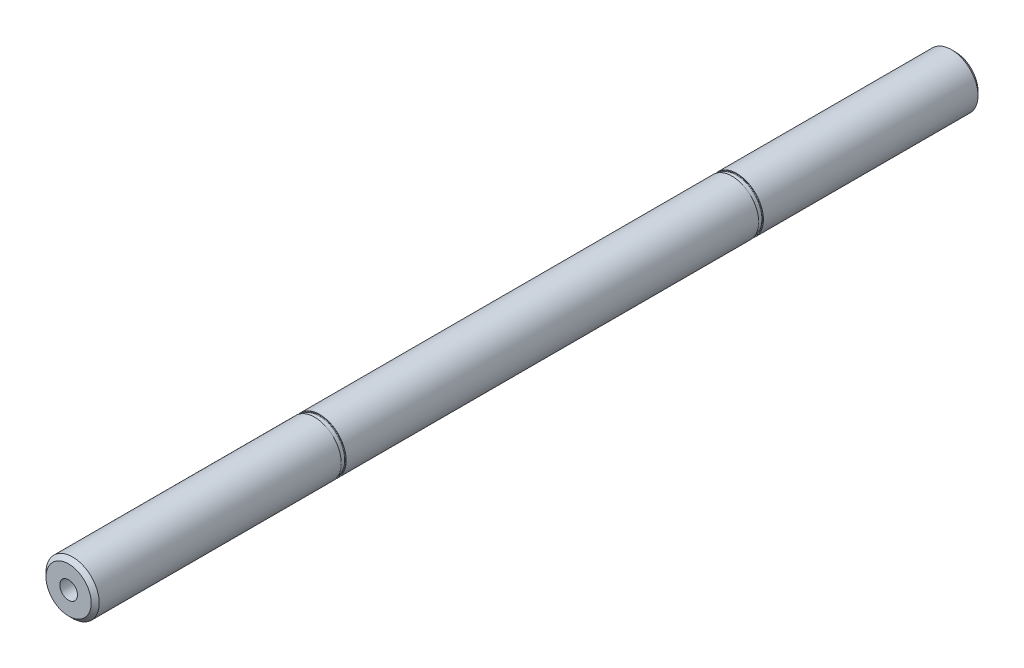
ISO-10303-21;
HEADER;
FILE_DESCRIPTION(('STEP AP214'),'2;1');
FILE_NAME('part.step','',(''),(''),'','','');
FILE_SCHEMA(('AUTOMOTIVE_DESIGN { 1 0 10303 214 1 1 1 1 }'));
ENDSEC;
DATA;
#1=APPLICATION_CONTEXT('core data for automotive mechanical design processes');
#2=APPLICATION_PROTOCOL_DEFINITION('international standard','automotive_design',2000,#1);
#3=PRODUCT_CONTEXT('',#1,'mechanical');
#4=PRODUCT('Part','Part','',(#3));
#5=PRODUCT_RELATED_PRODUCT_CATEGORY('part','',(#4));
#6=PRODUCT_DEFINITION_FORMATION('','',#4);
#7=PRODUCT_DEFINITION_CONTEXT('part definition',#1,'design');
#8=PRODUCT_DEFINITION('design','',#6,#7);
#9=PRODUCT_DEFINITION_SHAPE('','',#8);
#10=(LENGTH_UNIT() NAMED_UNIT(*) SI_UNIT(.MILLI.,.METRE.));
#11=(NAMED_UNIT(*) PLANE_ANGLE_UNIT() SI_UNIT($,.RADIAN.));
#12=(NAMED_UNIT(*) SI_UNIT($,.STERADIAN.) SOLID_ANGLE_UNIT());
#13=UNCERTAINTY_MEASURE_WITH_UNIT(LENGTH_MEASURE(1.E-05),#10,'distance_accuracy_value','');
#14=(GEOMETRIC_REPRESENTATION_CONTEXT(3) GLOBAL_UNCERTAINTY_ASSIGNED_CONTEXT((#13)) GLOBAL_UNIT_ASSIGNED_CONTEXT((#10,
#11,#12)) REPRESENTATION_CONTEXT('',''));
#15=CARTESIAN_POINT('',(0.,0.,0.));
#16=DIRECTION('',(0.,0.,1.));
#17=DIRECTION('',(1.,0.,0.));
#18=AXIS2_PLACEMENT_3D('',#15,#16,#17);
#19=CARTESIAN_POINT('',(0.,0.,100.));
#20=DIRECTION('',(0.,0.,-1.));
#21=DIRECTION('',(-1.,0.,0.));
#22=AXIS2_PLACEMENT_3D('',#19,#20,#21);
#23=CYLINDRICAL_SURFACE('',#22,6.);
#24=CARTESIAN_POINT('',(0.,0.,43.4));
#25=DIRECTION('',(0.,0.,1.));
#26=DIRECTION('',(1.,0.,0.));
#27=AXIS2_PLACEMENT_3D('',#24,#25,#26);
#28=CIRCLE('',#27,6.);
#29=CARTESIAN_POINT('',(6.,0.,43.4));
#30=VERTEX_POINT('',#29);
#31=EDGE_CURVE('E49',#30,#30,#28,.T.);
#32=ORIENTED_EDGE('',*,*,#31,.F.);
#33=EDGE_LOOP('',(#32));
#34=FACE_BOUND('',#33,.T.);
#35=CARTESIAN_POINT('',(0.,0.,-49.6454617677444));
#36=DIRECTION('',(0.,0.,-1.));
#37=DIRECTION('',(-1.,0.,0.));
#38=AXIS2_PLACEMENT_3D('',#35,#36,#37);
#39=CIRCLE('',#38,6.);
#40=CARTESIAN_POINT('',(-6.,0.,-49.6454617677444));
#41=VERTEX_POINT('',#40);
#42=EDGE_CURVE('E36',#41,#41,#39,.T.);
#43=ORIENTED_EDGE('',*,*,#42,.F.);
#44=EDGE_LOOP('',(#43));
#45=FACE_BOUND('',#44,.T.);
#46=ADVANCED_FACE('F32',(#34,#45),#23,.T.);
#47=CARTESIAN_POINT('',(0.,0.,-99.1));
#48=DIRECTION('',(0.,0.,1.));
#49=DIRECTION('',(1.,0.,0.));
#50=AXIS2_PLACEMENT_3D('',#47,#48,#49);
#51=CIRCLE('',#50,6.);
#52=CARTESIAN_POINT('',(5.99999999999999,0.,-99.1));
#53=VERTEX_POINT('',#52);
#54=EDGE_CURVE('E45',#53,#53,#51,.T.);
#55=ORIENTED_EDGE('',*,*,#54,.T.);
#56=EDGE_LOOP('',(#55));
#57=FACE_BOUND('',#56,.T.);
#58=CARTESIAN_POINT('',(0.,0.,-50.7));
#59=DIRECTION('',(0.,0.,1.));
#60=DIRECTION('',(1.,0.,0.));
#61=AXIS2_PLACEMENT_3D('',#58,#59,#60);
#62=CIRCLE('',#61,6.);
#63=CARTESIAN_POINT('',(6.,0.,-50.7));
#64=VERTEX_POINT('',#63);
#65=EDGE_CURVE('E56',#64,#64,#62,.T.);
#66=ORIENTED_EDGE('',*,*,#65,.F.);
#67=EDGE_LOOP('',(#66));
#68=FACE_BOUND('',#67,.T.);
#69=ADVANCED_FACE('F93',(#57,#68),#23,.T.);
#70=CARTESIAN_POINT('',(0.,0.,99.1));
#71=DIRECTION('',(0.,0.,1.));
#72=DIRECTION('',(1.,0.,0.));
#73=AXIS2_PLACEMENT_3D('',#70,#71,#72);
#74=CIRCLE('',#73,6.);
#75=CARTESIAN_POINT('',(-6.00000000000001,0.,99.1));
#76=VERTEX_POINT('',#75);
#77=EDGE_CURVE('E88',#76,#76,#74,.F.);
#78=ORIENTED_EDGE('',*,*,#77,.T.);
#79=EDGE_LOOP('',(#78));
#80=FACE_BOUND('',#79,.T.);
#81=CARTESIAN_POINT('',(0.,0.,44.5));
#82=DIRECTION('',(0.,0.,-1.));
#83=DIRECTION('',(-1.,0.,0.));
#84=AXIS2_PLACEMENT_3D('',#81,#82,#83);
#85=CIRCLE('',#84,6.);
#86=CARTESIAN_POINT('',(-6.,0.,44.5));
#87=VERTEX_POINT('',#86);
#88=EDGE_CURVE('E52',#87,#87,#85,.T.);
#89=ORIENTED_EDGE('',*,*,#88,.F.);
#90=EDGE_LOOP('',(#89));
#91=FACE_BOUND('',#90,.T.);
#92=ADVANCED_FACE('F113',(#80,#91),#23,.T.);
#93=CARTESIAN_POINT('',(0.,0.,100.));
#94=DIRECTION('',(0.,0.,1.));
#95=DIRECTION('',(1.,0.,0.));
#96=AXIS2_PLACEMENT_3D('',#93,#94,#95);
#97=PLANE('',#96);
#98=CARTESIAN_POINT('',(0.,0.,100.));
#99=DIRECTION('',(0.,0.,1.));
#100=DIRECTION('',(1.,0.,0.));
#101=AXIS2_PLACEMENT_3D('',#98,#99,#100);
#102=CIRCLE('',#101,2.);
#103=CARTESIAN_POINT('',(2.,0.,100.));
#104=VERTEX_POINT('',#103);
#105=EDGE_CURVE('E55',#104,#104,#102,.T.);
#106=ORIENTED_EDGE('',*,*,#105,.F.);
#107=EDGE_LOOP('',(#106));
#108=FACE_BOUND('',#107,.T.);
#109=CARTESIAN_POINT('',(0.,0.,100.));
#110=DIRECTION('',(0.,0.,1.));
#111=DIRECTION('',(1.,0.,0.));
#112=AXIS2_PLACEMENT_3D('',#109,#110,#111);
#113=CIRCLE('',#112,5.09999999999997);
#114=CARTESIAN_POINT('',(-5.09999999999997,0.,100.));
#115=VERTEX_POINT('',#114);
#116=EDGE_CURVE('E10',#115,#115,#113,.T.);
#117=ORIENTED_EDGE('',*,*,#116,.T.);
#118=EDGE_LOOP('',(#117));
#119=FACE_BOUND('',#118,.T.);
#120=ADVANCED_FACE('F106',(#108,#119),#97,.T.);
#121=CARTESIAN_POINT('',(0.,0.,-100.));
#122=DIRECTION('',(0.,0.,1.));
#123=DIRECTION('',(1.,0.,0.));
#124=AXIS2_PLACEMENT_3D('',#121,#122,#123);
#125=PLANE('',#124);
#126=CARTESIAN_POINT('',(0.,0.,-100.));
#127=DIRECTION('',(0.,0.,1.));
#128=DIRECTION('',(1.,0.,0.));
#129=AXIS2_PLACEMENT_3D('',#126,#127,#128);
#130=CIRCLE('',#129,2.);
#131=CARTESIAN_POINT('',(2.,0.,-100.));
#132=VERTEX_POINT('',#131);
#133=EDGE_CURVE('E85',#132,#132,#130,.T.);
#134=ORIENTED_EDGE('',*,*,#133,.T.);
#135=EDGE_LOOP('',(#134));
#136=FACE_BOUND('',#135,.T.);
#137=CARTESIAN_POINT('',(0.,0.,-100.));
#138=DIRECTION('',(0.,0.,1.));
#139=DIRECTION('',(1.,0.,0.));
#140=AXIS2_PLACEMENT_3D('',#137,#138,#139);
#141=CIRCLE('',#140,5.09999999999999);
#142=CARTESIAN_POINT('',(5.09999999999999,0.,-100.));
#143=VERTEX_POINT('',#142);
#144=EDGE_CURVE('E40',#143,#143,#141,.F.);
#145=ORIENTED_EDGE('',*,*,#144,.T.);
#146=EDGE_LOOP('',(#145));
#147=FACE_BOUND('',#146,.T.);
#148=ADVANCED_FACE('F98',(#136,#147),#125,.F.);
#149=CARTESIAN_POINT('',(0.,0.,-99.1));
#150=DIRECTION('',(0.,0.,1.));
#151=DIRECTION('',(1.,0.,0.));
#152=AXIS2_PLACEMENT_3D('',#149,#150,#151);
#153=CONICAL_SURFACE('',#152,6.,0.785398163397446);
#154=CARTESIAN_POINT('',(5.09999999999999,0.,-100.));
#155=CARTESIAN_POINT('',(5.10937499999999,0.,-99.990625));
#156=CARTESIAN_POINT('',(5.11874999999999,0.,-99.98125));
#157=CARTESIAN_POINT('',(5.13749999999999,0.,-99.9625));
#158=CARTESIAN_POINT('',(5.14687499999999,0.,-99.953125));
#159=CARTESIAN_POINT('',(5.16562499999999,0.,-99.934375));
#160=CARTESIAN_POINT('',(5.17499999999998,0.,-99.925));
#161=CARTESIAN_POINT('',(5.19374999999999,0.,-99.90625));
#162=CARTESIAN_POINT('',(5.20312499999999,0.,-99.896875));
#163=CARTESIAN_POINT('',(5.22187499999999,0.,-99.878125));
#164=CARTESIAN_POINT('',(5.23124999999999,0.,-99.86875));
#165=CARTESIAN_POINT('',(5.24999999999999,0.,-99.85));
#166=CARTESIAN_POINT('',(5.25937499999999,0.,-99.840625));
#167=CARTESIAN_POINT('',(5.27812499999999,0.,-99.821875));
#168=CARTESIAN_POINT('',(5.28749999999999,0.,-99.8125));
#169=CARTESIAN_POINT('',(5.30624999999999,0.,-99.79375));
#170=CARTESIAN_POINT('',(5.31562499999999,0.,-99.784375));
#171=CARTESIAN_POINT('',(5.33437499999999,0.,-99.765625));
#172=CARTESIAN_POINT('',(5.34374999999999,0.,-99.75625));
#173=CARTESIAN_POINT('',(5.36249999999999,0.,-99.7375));
#174=CARTESIAN_POINT('',(5.37187499999999,0.,-99.728125));
#175=CARTESIAN_POINT('',(5.39062499999999,0.,-99.709375));
#176=CARTESIAN_POINT('',(5.39999999999999,0.,-99.7));
#177=CARTESIAN_POINT('',(5.41874999999999,0.,-99.68125));
#178=CARTESIAN_POINT('',(5.42812499999999,0.,-99.671875));
#179=CARTESIAN_POINT('',(5.44687499999999,0.,-99.653125));
#180=CARTESIAN_POINT('',(5.45624999999999,0.,-99.64375));
#181=CARTESIAN_POINT('',(5.47499999999999,0.,-99.625));
#182=CARTESIAN_POINT('',(5.48437499999999,0.,-99.615625));
#183=CARTESIAN_POINT('',(5.50312499999999,0.,-99.596875));
#184=CARTESIAN_POINT('',(5.51249999999999,0.,-99.5875));
#185=CARTESIAN_POINT('',(5.53124999999999,0.,-99.56875));
#186=CARTESIAN_POINT('',(5.54062499999999,0.,-99.559375));
#187=CARTESIAN_POINT('',(5.55937499999999,0.,-99.540625));
#188=CARTESIAN_POINT('',(5.56874999999999,0.,-99.53125));
#189=CARTESIAN_POINT('',(5.58749999999999,0.,-99.5125));
#190=CARTESIAN_POINT('',(5.59687499999999,0.,-99.503125));
#191=CARTESIAN_POINT('',(5.61562499999999,0.,-99.484375));
#192=CARTESIAN_POINT('',(5.62499999999999,0.,-99.475));
#193=CARTESIAN_POINT('',(5.64374999999999,0.,-99.45625));
#194=CARTESIAN_POINT('',(5.65312499999999,0.,-99.446875));
#195=CARTESIAN_POINT('',(5.67187499999999,0.,-99.428125));
#196=CARTESIAN_POINT('',(5.68124999999999,0.,-99.41875));
#197=CARTESIAN_POINT('',(5.69999999999999,0.,-99.4));
#198=CARTESIAN_POINT('',(5.70937499999999,0.,-99.390625));
#199=CARTESIAN_POINT('',(5.72812499999999,0.,-99.371875));
#200=CARTESIAN_POINT('',(5.73749999999999,0.,-99.3625));
#201=CARTESIAN_POINT('',(5.75624999999999,0.,-99.34375));
#202=CARTESIAN_POINT('',(5.76562499999999,0.,-99.334375));
#203=CARTESIAN_POINT('',(5.78437499999999,0.,-99.315625));
#204=CARTESIAN_POINT('',(5.79374999999999,0.,-99.30625));
#205=CARTESIAN_POINT('',(5.81249999999999,0.,-99.2875));
#206=CARTESIAN_POINT('',(5.82187499999999,0.,-99.278125));
#207=CARTESIAN_POINT('',(5.84062499999999,0.,-99.259375));
#208=CARTESIAN_POINT('',(5.84999999999999,0.,-99.25));
#209=CARTESIAN_POINT('',(5.86874999999999,0.,-99.23125));
#210=CARTESIAN_POINT('',(5.87812499999999,0.,-99.221875));
#211=CARTESIAN_POINT('',(5.89687499999999,0.,-99.203125));
#212=CARTESIAN_POINT('',(5.90624999999999,0.,-99.19375));
#213=CARTESIAN_POINT('',(5.92499999999999,0.,-99.175));
#214=CARTESIAN_POINT('',(5.93437499999999,0.,-99.165625));
#215=CARTESIAN_POINT('',(5.95312499999999,0.,-99.146875));
#216=CARTESIAN_POINT('',(5.96249999999999,0.,-99.1375));
#217=CARTESIAN_POINT('',(5.98124999999999,0.,-99.11875));
#218=CARTESIAN_POINT('',(5.99062499999999,0.,-99.109375));
#219=CARTESIAN_POINT('',(5.99999999999999,0.,-99.1));
#220=B_SPLINE_CURVE_WITH_KNOTS('',3,(#154,#155,#156,#157,#158,#159,#160,#161,#162,#163,#164,
#165,#166,#167,#168,#169,#170,#171,#172,#173,#174,#175,#176,#177,#178,#179,#180,#181,#182,#183,
#184,#185,#186,#187,#188,#189,#190,#191,#192,#193,#194,#195,#196,#197,#198,#199,#200,#201,#202,
#203,#204,#205,#206,#207,#208,#209,#210,#211,#212,#213,#214,#215,#216,#217,#218,#219),
.UNSPECIFIED.,.F.,.F.,(4,2,2,2,2,2,2,2,2,2,2,2,2,2,2,2,2,2,2,2,2,2,2,2,2,2,2,2,2,2,2,2,4),(0.,
0.0397747564417457,0.0795495128834919,0.119324269325238,0.159099025766975,0.198873782208721,
0.238648538650467,0.278423295092213,0.318198051533949,0.357972807975696,0.397747564417442,
0.437522320859188,0.477297077300925,0.517071833742671,0.556846590184417,0.596621346626163,
0.636396103067899,0.676170859509646,0.715945615951392,0.755720372393138,0.795495128834874,
0.835269885276621,0.875044641718366,0.914819398160113,0.954594154601859,0.994368911043595,
1.03414366748534,1.07391842392709,1.11369318036883,1.15346793681057,1.19324269325232,
1.23301744969406,1.27279220613581),.UNSPECIFIED.);
#221=EDGE_CURVE('BSEAM96',#143,#53,#220,.T.);
#222=ORIENTED_EDGE('',*,*,#144,.F.);
#223=ORIENTED_EDGE('',*,*,#54,.F.);
#224=ORIENTED_EDGE('',*,*,#221,.T.);
#225=ORIENTED_EDGE('',*,*,#221,.F.);
#226=EDGE_LOOP('',(#222,#224,#223,#225));
#227=FACE_BOUND('',#226,.T.);
#228=ADVANCED_FACE('F96',(#227),#153,.T.);
#229=CARTESIAN_POINT('',(0.,0.,100.));
#230=DIRECTION('',(0.,0.,-1.));
#231=DIRECTION('',(-1.,0.,0.));
#232=AXIS2_PLACEMENT_3D('',#229,#230,#231);
#233=CONICAL_SURFACE('',#232,5.09999999999997,0.785398163397461);
#234=CARTESIAN_POINT('',(-6.00000000000001,0.,99.1));
#235=CARTESIAN_POINT('',(-5.99062500000001,0.,99.109375));
#236=CARTESIAN_POINT('',(-5.98125000000001,0.,99.11875));
#237=CARTESIAN_POINT('',(-5.96250000000001,0.,99.1375));
#238=CARTESIAN_POINT('',(-5.95312500000001,0.,99.146875));
#239=CARTESIAN_POINT('',(-5.93437500000001,0.,99.165625));
#240=CARTESIAN_POINT('',(-5.92500000000001,0.,99.175));
#241=CARTESIAN_POINT('',(-5.90625000000001,0.,99.19375));
#242=CARTESIAN_POINT('',(-5.896875,0.,99.203125));
#243=CARTESIAN_POINT('',(-5.878125,0.,99.221875));
#244=CARTESIAN_POINT('',(-5.86875,0.,99.23125));
#245=CARTESIAN_POINT('',(-5.85,0.,99.25));
#246=CARTESIAN_POINT('',(-5.840625,0.,99.259375));
#247=CARTESIAN_POINT('',(-5.821875,0.,99.278125));
#248=CARTESIAN_POINT('',(-5.8125,0.,99.2875));
#249=CARTESIAN_POINT('',(-5.79375,0.,99.30625));
#250=CARTESIAN_POINT('',(-5.784375,0.,99.315625));
#251=CARTESIAN_POINT('',(-5.765625,0.,99.334375));
#252=CARTESIAN_POINT('',(-5.75625,0.,99.34375));
#253=CARTESIAN_POINT('',(-5.7375,0.,99.3625));
#254=CARTESIAN_POINT('',(-5.728125,0.,99.371875));
#255=CARTESIAN_POINT('',(-5.709375,0.,99.390625));
#256=CARTESIAN_POINT('',(-5.7,0.,99.4));
#257=CARTESIAN_POINT('',(-5.68125,0.,99.41875));
#258=CARTESIAN_POINT('',(-5.67187499999999,0.,99.428125));
#259=CARTESIAN_POINT('',(-5.65312499999999,0.,99.446875));
#260=CARTESIAN_POINT('',(-5.64374999999999,0.,99.45625));
#261=CARTESIAN_POINT('',(-5.62499999999999,0.,99.475));
#262=CARTESIAN_POINT('',(-5.61562499999999,0.,99.484375));
#263=CARTESIAN_POINT('',(-5.59687499999999,0.,99.503125));
#264=CARTESIAN_POINT('',(-5.58749999999999,0.,99.5125));
#265=CARTESIAN_POINT('',(-5.56874999999999,0.,99.53125));
#266=CARTESIAN_POINT('',(-5.55937499999999,0.,99.540625));
#267=CARTESIAN_POINT('',(-5.54062499999999,0.,99.559375));
#268=CARTESIAN_POINT('',(-5.53124999999999,0.,99.56875));
#269=CARTESIAN_POINT('',(-5.51249999999999,0.,99.5875));
#270=CARTESIAN_POINT('',(-5.50312499999999,0.,99.596875));
#271=CARTESIAN_POINT('',(-5.48437499999999,0.,99.615625));
#272=CARTESIAN_POINT('',(-5.47499999999999,0.,99.625));
#273=CARTESIAN_POINT('',(-5.45624999999999,0.,99.64375));
#274=CARTESIAN_POINT('',(-5.44687499999999,0.,99.653125));
#275=CARTESIAN_POINT('',(-5.42812499999998,0.,99.671875));
#276=CARTESIAN_POINT('',(-5.41874999999998,0.,99.68125));
#277=CARTESIAN_POINT('',(-5.39999999999998,0.,99.7));
#278=CARTESIAN_POINT('',(-5.39062499999998,0.,99.709375));
#279=CARTESIAN_POINT('',(-5.37187499999998,0.,99.728125));
#280=CARTESIAN_POINT('',(-5.36249999999998,0.,99.7375));
#281=CARTESIAN_POINT('',(-5.34374999999998,0.,99.75625));
#282=CARTESIAN_POINT('',(-5.33437499999998,0.,99.765625));
#283=CARTESIAN_POINT('',(-5.31562499999998,0.,99.784375));
#284=CARTESIAN_POINT('',(-5.30624999999998,0.,99.79375));
#285=CARTESIAN_POINT('',(-5.28749999999998,0.,99.8125));
#286=CARTESIAN_POINT('',(-5.27812499999998,0.,99.821875));
#287=CARTESIAN_POINT('',(-5.25937499999998,0.,99.840625));
#288=CARTESIAN_POINT('',(-5.24999999999998,0.,99.85));
#289=CARTESIAN_POINT('',(-5.23124999999998,0.,99.86875));
#290=CARTESIAN_POINT('',(-5.22187499999998,0.,99.878125));
#291=CARTESIAN_POINT('',(-5.20312499999998,0.,99.896875));
#292=CARTESIAN_POINT('',(-5.19374999999998,0.,99.90625));
#293=CARTESIAN_POINT('',(-5.17499999999997,0.,99.925));
#294=CARTESIAN_POINT('',(-5.16562499999997,0.,99.934375));
#295=CARTESIAN_POINT('',(-5.14687499999998,0.,99.953125));
#296=CARTESIAN_POINT('',(-5.13749999999997,0.,99.9625));
#297=CARTESIAN_POINT('',(-5.11874999999997,0.,99.98125));
#298=CARTESIAN_POINT('',(-5.10937499999997,0.,99.990625));
#299=CARTESIAN_POINT('',(-5.09999999999997,0.,100.));
#300=B_SPLINE_CURVE_WITH_KNOTS('',3,(#234,#235,#236,#237,#238,#239,#240,#241,#242,#243,#244,
#245,#246,#247,#248,#249,#250,#251,#252,#253,#254,#255,#256,#257,#258,#259,#260,#261,#262,#263,
#264,#265,#266,#267,#268,#269,#270,#271,#272,#273,#274,#275,#276,#277,#278,#279,#280,#281,#282,
#283,#284,#285,#286,#287,#288,#289,#290,#291,#292,#293,#294,#295,#296,#297,#298,#299),
.UNSPECIFIED.,.F.,.F.,(4,2,2,2,2,2,2,2,2,2,2,2,2,2,2,2,2,2,2,2,2,2,2,2,2,2,2,2,2,2,2,2,4),(0.,
0.0397747564417469,0.0795495128834932,0.11932426932524,0.159099025766977,0.198873782208724,
0.238648538650471,0.278423295092218,0.318198051533955,0.357972807975701,0.397747564417448,
0.437522320859195,0.477297077300932,0.517071833742679,0.556846590184426,0.596621346626173,
0.636396103067909,0.676170859509656,0.715945615951403,0.75572037239315,0.795495128834887,
0.835269885276634,0.87504464171838,0.914819398160127,0.954594154601874,0.994368911043611,
1.03414366748536,1.07391842392711,1.11369318036885,1.15346793681059,1.19324269325234,
1.23301744969408,1.27279220613583),.UNSPECIFIED.);
#301=EDGE_CURVE('BSEAM34',#76,#115,#300,.T.);
#302=ORIENTED_EDGE('',*,*,#77,.F.);
#303=ORIENTED_EDGE('',*,*,#116,.F.);
#304=ORIENTED_EDGE('',*,*,#301,.T.);
#305=ORIENTED_EDGE('',*,*,#301,.F.);
#306=EDGE_LOOP('',(#302,#304,#303,#305));
#307=FACE_BOUND('',#306,.T.);
#308=ADVANCED_FACE('F34',(#307),#233,.T.);
#309=CARTESIAN_POINT('',(0.,0.,-100.));
#310=DIRECTION('',(0.,0.,1.));
#311=DIRECTION('',(1.,0.,0.));
#312=AXIS2_PLACEMENT_3D('',#309,#310,#311);
#313=CYLINDRICAL_SURFACE('',#312,2.);
#314=ORIENTED_EDGE('',*,*,#133,.F.);
#315=EDGE_LOOP('',(#314));
#316=FACE_BOUND('',#315,.T.);
#317=ORIENTED_EDGE('',*,*,#105,.T.);
#318=EDGE_LOOP('',(#317));
#319=FACE_BOUND('',#318,.T.);
#320=ADVANCED_FACE('F104',(#316,#319),#313,.F.);
#321=CARTESIAN_POINT('',(0.,5.86,44.5));
#322=DIRECTION('',(0.,0.,-1.));
#323=DIRECTION('',(-1.,0.,0.));
#324=AXIS2_PLACEMENT_3D('',#321,#322,#323);
#325=PLANE('',#324);
#326=CARTESIAN_POINT('',(0.,0.,44.5));
#327=DIRECTION('',(0.,0.,-1.));
#328=DIRECTION('',(-1.,0.,0.));
#329=AXIS2_PLACEMENT_3D('',#326,#327,#328);
#330=CIRCLE('',#329,5.86);
#331=CARTESIAN_POINT('',(-5.86,0.,44.5));
#332=VERTEX_POINT('',#331);
#333=EDGE_CURVE('E53',#332,#332,#330,.T.);
#334=ORIENTED_EDGE('',*,*,#333,.F.);
#335=EDGE_LOOP('',(#334));
#336=FACE_BOUND('',#335,.T.);
#337=ORIENTED_EDGE('',*,*,#88,.T.);
#338=EDGE_LOOP('',(#337));
#339=FACE_BOUND('',#338,.T.);
#340=ADVANCED_FACE('F133',(#336,#339),#325,.T.);
#341=CARTESIAN_POINT('',(0.,7.2,43.4));
#342=DIRECTION('',(0.,0.,1.));
#343=DIRECTION('',(1.,0.,0.));
#344=AXIS2_PLACEMENT_3D('',#341,#342,#343);
#345=PLANE('',#344);
#346=CARTESIAN_POINT('',(0.,0.,43.4));
#347=DIRECTION('',(0.,0.,-1.));
#348=DIRECTION('',(-1.,0.,0.));
#349=AXIS2_PLACEMENT_3D('',#346,#347,#348);
#350=CIRCLE('',#349,5.86);
#351=CARTESIAN_POINT('',(-5.86,0.,43.4));
#352=VERTEX_POINT('',#351);
#353=EDGE_CURVE('E62',#352,#352,#350,.T.);
#354=ORIENTED_EDGE('',*,*,#353,.T.);
#355=EDGE_LOOP('',(#354));
#356=FACE_BOUND('',#355,.T.);
#357=ORIENTED_EDGE('',*,*,#31,.T.);
#358=EDGE_LOOP('',(#357));
#359=FACE_BOUND('',#358,.T.);
#360=ADVANCED_FACE('F135',(#356,#359),#345,.T.);
#361=CARTESIAN_POINT('',(0.,0.,44.39));
#362=DIRECTION('',(0.,0.,-1.));
#363=DIRECTION('',(-1.,0.,0.));
#364=AXIS2_PLACEMENT_3D('',#361,#362,#363);
#365=TOROIDAL_SURFACE('',#364,5.86,0.109999999999999);
#366=ORIENTED_EDGE('',*,*,#333,.T.);
#367=EDGE_LOOP('',(#366));
#368=FACE_BOUND('',#367,.T.);
#369=CARTESIAN_POINT('',(0.,0.,44.39));
#370=DIRECTION('',(0.,0.,-1.));
#371=DIRECTION('',(-1.,0.,0.));
#372=AXIS2_PLACEMENT_3D('',#369,#370,#371);
#373=CIRCLE('',#372,5.75);
#374=CARTESIAN_POINT('',(-5.75,0.,44.39));
#375=VERTEX_POINT('',#374);
#376=EDGE_CURVE('E78',#375,#375,#373,.T.);
#377=ORIENTED_EDGE('',*,*,#376,.F.);
#378=EDGE_LOOP('',(#377));
#379=FACE_BOUND('',#378,.T.);
#380=ADVANCED_FACE('F140',(#368,#379),#365,.F.);
#381=CARTESIAN_POINT('',(0.,0.,150.));
#382=DIRECTION('',(0.,0.,-1.));
#383=DIRECTION('',(-1.,0.,0.));
#384=AXIS2_PLACEMENT_3D('',#381,#382,#383);
#385=CYLINDRICAL_SURFACE('',#384,5.75);
#386=ORIENTED_EDGE('',*,*,#376,.T.);
#387=EDGE_LOOP('',(#386));
#388=FACE_BOUND('',#387,.T.);
#389=CARTESIAN_POINT('',(0.,0.,43.51));
#390=DIRECTION('',(0.,0.,-1.));
#391=DIRECTION('',(-1.,0.,0.));
#392=AXIS2_PLACEMENT_3D('',#389,#390,#391);
#393=CIRCLE('',#392,5.75);
#394=CARTESIAN_POINT('',(-5.75,0.,43.51));
#395=VERTEX_POINT('',#394);
#396=EDGE_CURVE('E75',#395,#395,#393,.T.);
#397=ORIENTED_EDGE('',*,*,#396,.F.);
#398=EDGE_LOOP('',(#397));
#399=FACE_BOUND('',#398,.T.);
#400=ADVANCED_FACE('F150',(#388,#399),#385,.T.);
#401=CARTESIAN_POINT('',(0.,0.,43.51));
#402=DIRECTION('',(0.,0.,-1.));
#403=DIRECTION('',(-1.,0.,0.));
#404=AXIS2_PLACEMENT_3D('',#401,#402,#403);
#405=TOROIDAL_SURFACE('',#404,5.86,0.109999999999999);
#406=ORIENTED_EDGE('',*,*,#396,.T.);
#407=EDGE_LOOP('',(#406));
#408=FACE_BOUND('',#407,.T.);
#409=ORIENTED_EDGE('',*,*,#353,.F.);
#410=EDGE_LOOP('',(#409));
#411=FACE_BOUND('',#410,.T.);
#412=ADVANCED_FACE('F154',(#408,#411),#405,.F.);
#413=CARTESIAN_POINT('',(0.,0.,-49.6071521936804));
#414=DIRECTION('',(0.,0.,-1.));
#415=DIRECTION('',(-1.,0.,0.));
#416=AXIS2_PLACEMENT_3D('',#413,#414,#415);
#417=CONICAL_SURFACE('',#416,5.89901703134819,1.20820283667991);
#418=CARTESIAN_POINT('',(0.,0.,-49.6071521936804));
#419=DIRECTION('',(0.,0.,-1.));
#420=DIRECTION('',(-1.,0.,0.));
#421=AXIS2_PLACEMENT_3D('',#418,#419,#420);
#422=CIRCLE('',#421,5.89901703134819);
#423=CARTESIAN_POINT('',(-5.89901703134819,0.,-49.6071521936804));
#424=VERTEX_POINT('',#423);
#425=EDGE_CURVE('E58',#424,#424,#422,.T.);
#426=ORIENTED_EDGE('',*,*,#425,.F.);
#427=EDGE_LOOP('',(#426));
#428=FACE_BOUND('',#427,.T.);
#429=ORIENTED_EDGE('',*,*,#42,.T.);
#430=EDGE_LOOP('',(#429));
#431=FACE_BOUND('',#430,.T.);
#432=ADVANCED_FACE('F157',(#428,#431),#417,.F.);
#433=CARTESIAN_POINT('',(0.,7.2,-50.7));
#434=DIRECTION('',(0.,0.,1.));
#435=DIRECTION('',(1.,0.,0.));
#436=AXIS2_PLACEMENT_3D('',#433,#434,#435);
#437=PLANE('',#436);
#438=CARTESIAN_POINT('',(0.,0.,-50.7));
#439=DIRECTION('',(0.,0.,-1.));
#440=DIRECTION('',(-1.,0.,0.));
#441=AXIS2_PLACEMENT_3D('',#438,#439,#440);
#442=CIRCLE('',#441,5.85999999999998);
#443=CARTESIAN_POINT('',(-5.85999999999998,0.,-50.7));
#444=VERTEX_POINT('',#443);
#445=EDGE_CURVE('E181',#444,#444,#442,.T.);
#446=ORIENTED_EDGE('',*,*,#445,.T.);
#447=EDGE_LOOP('',(#446));
#448=FACE_BOUND('',#447,.T.);
#449=ORIENTED_EDGE('',*,*,#65,.T.);
#450=EDGE_LOOP('',(#449));
#451=FACE_BOUND('',#450,.T.);
#452=ADVANCED_FACE('F162',(#448,#451),#437,.T.);
#453=CARTESIAN_POINT('',(0.,0.,-49.7100000000001));
#454=DIRECTION('',(0.,0.,-1.));
#455=DIRECTION('',(-1.,0.,0.));
#456=AXIS2_PLACEMENT_3D('',#453,#454,#455);
#457=TOROIDAL_SURFACE('',#456,5.85999999999998,0.110000000000001);
#458=ORIENTED_EDGE('',*,*,#425,.T.);
#459=EDGE_LOOP('',(#458));
#460=FACE_BOUND('',#459,.T.);
#461=CARTESIAN_POINT('',(0.,0.,-49.7100000000001));
#462=DIRECTION('',(0.,0.,-1.));
#463=DIRECTION('',(-1.,0.,0.));
#464=AXIS2_PLACEMENT_3D('',#461,#462,#463);
#465=CIRCLE('',#464,5.74999999999998);
#466=CARTESIAN_POINT('',(-5.74999999999998,0.,-49.7100000000001));
#467=VERTEX_POINT('',#466);
#468=EDGE_CURVE('E64',#467,#467,#465,.T.);
#469=ORIENTED_EDGE('',*,*,#468,.F.);
#470=EDGE_LOOP('',(#469));
#471=FACE_BOUND('',#470,.T.);
#472=ADVANCED_FACE('F164',(#460,#471),#457,.F.);
#473=CARTESIAN_POINT('',(0.,0.,150.));
#474=DIRECTION('',(0.,0.,-1.));
#475=DIRECTION('',(-1.,0.,0.));
#476=AXIS2_PLACEMENT_3D('',#473,#474,#475);
#477=CYLINDRICAL_SURFACE('',#476,5.74999999999998);
#478=ORIENTED_EDGE('',*,*,#468,.T.);
#479=EDGE_LOOP('',(#478));
#480=FACE_BOUND('',#479,.T.);
#481=CARTESIAN_POINT('',(0.,0.,-50.59));
#482=DIRECTION('',(0.,0.,-1.));
#483=DIRECTION('',(-1.,0.,0.));
#484=AXIS2_PLACEMENT_3D('',#481,#482,#483);
#485=CIRCLE('',#484,5.74999999999998);
#486=CARTESIAN_POINT('',(-5.74999999999998,0.,-50.59));
#487=VERTEX_POINT('',#486);
#488=EDGE_CURVE('E69',#487,#487,#485,.T.);
#489=ORIENTED_EDGE('',*,*,#488,.F.);
#490=EDGE_LOOP('',(#489));
#491=FACE_BOUND('',#490,.T.);
#492=ADVANCED_FACE('F167',(#480,#491),#477,.T.);
#493=CARTESIAN_POINT('',(0.,0.,-50.59));
#494=DIRECTION('',(0.,0.,-1.));
#495=DIRECTION('',(-1.,0.,0.));
#496=AXIS2_PLACEMENT_3D('',#493,#494,#495);
#497=TOROIDAL_SURFACE('',#496,5.85999999999998,0.109999999999999);
#498=ORIENTED_EDGE('',*,*,#488,.T.);
#499=EDGE_LOOP('',(#498));
#500=FACE_BOUND('',#499,.T.);
#501=ORIENTED_EDGE('',*,*,#445,.F.);
#502=EDGE_LOOP('',(#501));
#503=FACE_BOUND('',#502,.T.);
#504=ADVANCED_FACE('F170',(#500,#503),#497,.F.);
#505=CLOSED_SHELL('',(#46,#69,#92,#120,#148,#228,#308,#320,#340,#360,#380,#400,#412,#432,#452,
#472,#492,#504));
#506=MANIFOLD_SOLID_BREP('B2',#505);
#507=ADVANCED_BREP_SHAPE_REPRESENTATION('',(#18,#506),#14);
#508=SHAPE_DEFINITION_REPRESENTATION(#9,#507);
ENDSEC;
END-ISO-10303-21;
